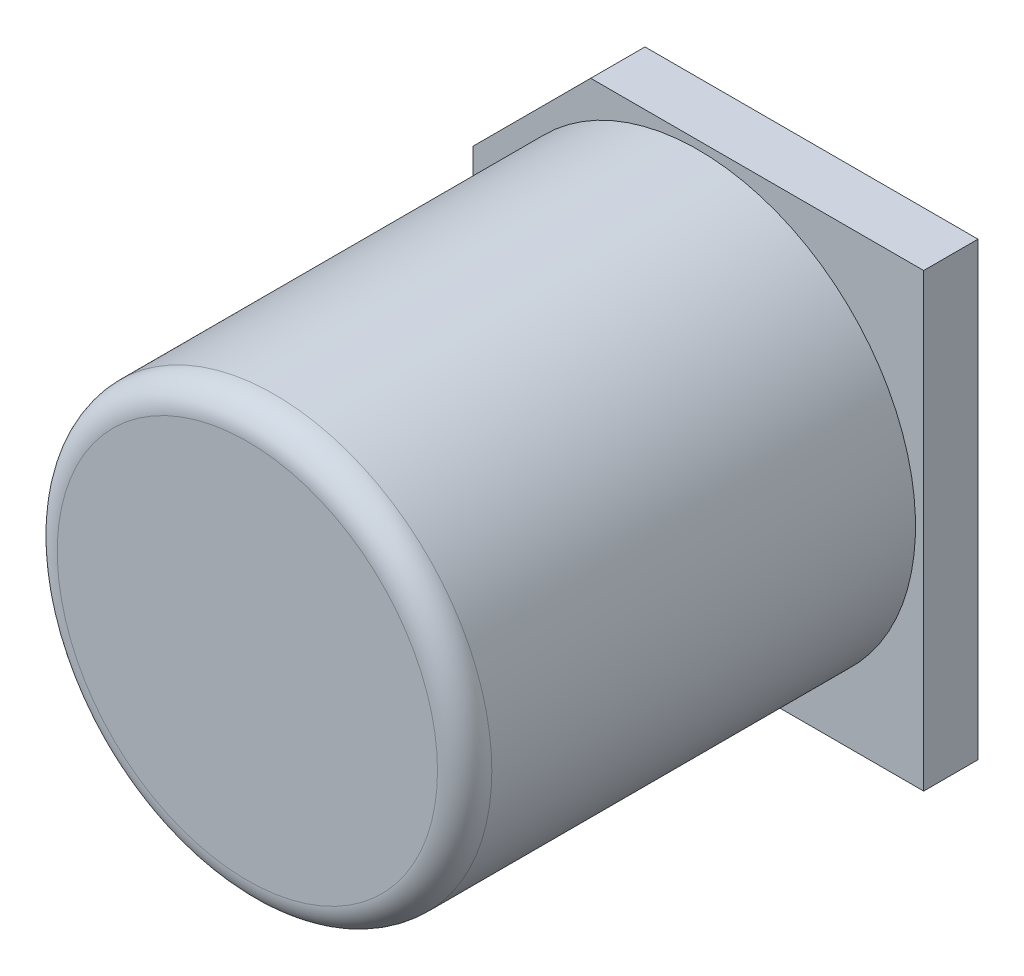
ISO-10303-21;
HEADER;
FILE_DESCRIPTION(('STEP AP214'),'2;1');
FILE_NAME('part.step','',(''),(''),'','','');
FILE_SCHEMA(('AUTOMOTIVE_DESIGN { 1 0 10303 214 1 1 1 1 }'));
ENDSEC;
DATA;
#1=APPLICATION_CONTEXT('core data for automotive mechanical design processes');
#2=APPLICATION_PROTOCOL_DEFINITION('international standard','automotive_design',2000,#1);
#3=PRODUCT_CONTEXT('',#1,'mechanical');
#4=PRODUCT('Part','Part','',(#3));
#5=PRODUCT_RELATED_PRODUCT_CATEGORY('part','',(#4));
#6=PRODUCT_DEFINITION_FORMATION('','',#4);
#7=PRODUCT_DEFINITION_CONTEXT('part definition',#1,'design');
#8=PRODUCT_DEFINITION('design','',#6,#7);
#9=PRODUCT_DEFINITION_SHAPE('','',#8);
#10=(LENGTH_UNIT() NAMED_UNIT(*) SI_UNIT(.MILLI.,.METRE.));
#11=(NAMED_UNIT(*) PLANE_ANGLE_UNIT() SI_UNIT($,.RADIAN.));
#12=(NAMED_UNIT(*) SI_UNIT($,.STERADIAN.) SOLID_ANGLE_UNIT());
#13=UNCERTAINTY_MEASURE_WITH_UNIT(LENGTH_MEASURE(1.E-05),#10,'distance_accuracy_value','');
#14=(GEOMETRIC_REPRESENTATION_CONTEXT(3) GLOBAL_UNCERTAINTY_ASSIGNED_CONTEXT((#13)) GLOBAL_UNIT_ASSIGNED_CONTEXT((#10,
#11,#12)) REPRESENTATION_CONTEXT('',''));
#15=CARTESIAN_POINT('',(0.,0.,0.));
#16=DIRECTION('',(0.,0.,1.));
#17=DIRECTION('',(1.,0.,0.));
#18=AXIS2_PLACEMENT_3D('',#15,#16,#17);
#19=CARTESIAN_POINT('',(4.15,4.15,1.));
#20=DIRECTION('',(-1.,0.,0.));
#21=DIRECTION('',(0.,0.,1.));
#22=AXIS2_PLACEMENT_3D('',#19,#20,#21);
#23=PLANE('',#22);
#24=DIRECTION('',(0.,1.,0.));
#25=VECTOR('',#24,1.);
#26=CARTESIAN_POINT('',(4.15,4.15,0.));
#27=LINE('',#26,#25);
#28=CARTESIAN_POINT('',(4.15,-4.15,0.));
#29=VERTEX_POINT('',#28);
#30=CARTESIAN_POINT('',(4.15,4.15,0.));
#31=VERTEX_POINT('',#30);
#32=EDGE_CURVE('E143',#29,#31,#27,.T.);
#33=ORIENTED_EDGE('',*,*,#32,.T.);
#34=DIRECTION('',(0.,0.,-1.));
#35=VECTOR('',#34,1.);
#36=CARTESIAN_POINT('',(4.15,4.15,1.));
#37=LINE('',#36,#35);
#38=CARTESIAN_POINT('',(4.15,4.15,1.));
#39=VERTEX_POINT('',#38);
#40=EDGE_CURVE('E169',#39,#31,#37,.T.);
#41=ORIENTED_EDGE('',*,*,#40,.F.);
#42=DIRECTION('',(0.,1.,0.));
#43=VECTOR('',#42,1.);
#44=CARTESIAN_POINT('',(4.15,4.15,1.));
#45=LINE('',#44,#43);
#46=CARTESIAN_POINT('',(4.15,-4.15,1.));
#47=VERTEX_POINT('',#46);
#48=EDGE_CURVE('E158',#47,#39,#45,.T.);
#49=ORIENTED_EDGE('',*,*,#48,.F.);
#50=DIRECTION('',(0.,0.,-1.));
#51=VECTOR('',#50,1.);
#52=CARTESIAN_POINT('',(4.15,-4.15,1.));
#53=LINE('',#52,#51);
#54=EDGE_CURVE('E139',#47,#29,#53,.T.);
#55=ORIENTED_EDGE('',*,*,#54,.T.);
#56=EDGE_LOOP('',(#33,#41,#49,#55));
#57=FACE_BOUND('',#56,.T.);
#58=ADVANCED_FACE('F51',(#57),#23,.F.);
#59=CARTESIAN_POINT('',(4.15,4.15,1.));
#60=DIRECTION('',(0.,-1.,0.));
#61=DIRECTION('',(1.,0.,0.));
#62=AXIS2_PLACEMENT_3D('',#59,#60,#61);
#63=PLANE('',#62);
#64=DIRECTION('',(-1.,0.,0.));
#65=VECTOR('',#64,1.);
#66=CARTESIAN_POINT('',(4.15,4.15,0.));
#67=LINE('',#66,#65);
#68=CARTESIAN_POINT('',(-1.98,4.15,0.));
#69=VERTEX_POINT('',#68);
#70=EDGE_CURVE('E146',#31,#69,#67,.T.);
#71=ORIENTED_EDGE('',*,*,#70,.T.);
#72=DIRECTION('',(0.,0.,-1.));
#73=VECTOR('',#72,1.);
#74=CARTESIAN_POINT('',(-1.98,4.15,1.));
#75=LINE('',#74,#73);
#76=CARTESIAN_POINT('',(-1.98,4.15,1.));
#77=VERTEX_POINT('',#76);
#78=EDGE_CURVE('E165',#77,#69,#75,.T.);
#79=ORIENTED_EDGE('',*,*,#78,.F.);
#80=DIRECTION('',(-1.,0.,0.));
#81=VECTOR('',#80,1.);
#82=CARTESIAN_POINT('',(4.15,4.15,1.));
#83=LINE('',#82,#81);
#84=EDGE_CURVE('E107',#39,#77,#83,.T.);
#85=ORIENTED_EDGE('',*,*,#84,.F.);
#86=ORIENTED_EDGE('',*,*,#40,.T.);
#87=EDGE_LOOP('',(#71,#79,#85,#86));
#88=FACE_BOUND('',#87,.T.);
#89=ADVANCED_FACE('F188',(#88),#63,.F.);
#90=CARTESIAN_POINT('',(-1.98,4.15,1.));
#91=DIRECTION('',(0.707106781186548,-0.707106781186547,0.));
#92=DIRECTION('',(0.707106781186547,0.707106781186548,0.));
#93=AXIS2_PLACEMENT_3D('',#90,#91,#92);
#94=PLANE('',#93);
#95=DIRECTION('',(-0.707106781186547,-0.707106781186548,0.));
#96=VECTOR('',#95,1.);
#97=CARTESIAN_POINT('',(-1.98,4.15,0.));
#98=LINE('',#97,#96);
#99=CARTESIAN_POINT('',(-4.15,1.98,0.));
#100=VERTEX_POINT('',#99);
#101=EDGE_CURVE('E149',#69,#100,#98,.T.);
#102=ORIENTED_EDGE('',*,*,#101,.T.);
#103=DIRECTION('',(0.,0.,-1.));
#104=VECTOR('',#103,1.);
#105=CARTESIAN_POINT('',(-4.15,1.98,1.));
#106=LINE('',#105,#104);
#107=CARTESIAN_POINT('',(-4.15,1.98,1.));
#108=VERTEX_POINT('',#107);
#109=EDGE_CURVE('E131',#108,#100,#106,.T.);
#110=ORIENTED_EDGE('',*,*,#109,.F.);
#111=DIRECTION('',(-0.707106781186547,-0.707106781186548,0.));
#112=VECTOR('',#111,1.);
#113=CARTESIAN_POINT('',(-1.98,4.15,1.));
#114=LINE('',#113,#112);
#115=EDGE_CURVE('E120',#77,#108,#114,.T.);
#116=ORIENTED_EDGE('',*,*,#115,.F.);
#117=ORIENTED_EDGE('',*,*,#78,.T.);
#118=EDGE_LOOP('',(#102,#110,#116,#117));
#119=FACE_BOUND('',#118,.T.);
#120=ADVANCED_FACE('F191',(#119),#94,.F.);
#121=CARTESIAN_POINT('',(-4.15,1.98,1.));
#122=DIRECTION('',(1.,0.,0.));
#123=DIRECTION('',(0.,1.,0.));
#124=AXIS2_PLACEMENT_3D('',#121,#122,#123);
#125=PLANE('',#124);
#126=DIRECTION('',(0.,-1.,0.));
#127=VECTOR('',#126,1.);
#128=CARTESIAN_POINT('',(-4.15,1.98,0.));
#129=LINE('',#128,#127);
#130=CARTESIAN_POINT('',(-4.15,-1.98,0.));
#131=VERTEX_POINT('',#130);
#132=EDGE_CURVE('E129',#100,#131,#129,.T.);
#133=ORIENTED_EDGE('',*,*,#132,.T.);
#134=DIRECTION('',(0.,0.,-1.));
#135=VECTOR('',#134,1.);
#136=CARTESIAN_POINT('',(-4.15,-1.98,1.));
#137=LINE('',#136,#135);
#138=CARTESIAN_POINT('',(-4.15,-1.98,1.));
#139=VERTEX_POINT('',#138);
#140=EDGE_CURVE('E126',#139,#131,#137,.T.);
#141=ORIENTED_EDGE('',*,*,#140,.F.);
#142=DIRECTION('',(0.,-1.,0.));
#143=VECTOR('',#142,1.);
#144=CARTESIAN_POINT('',(-4.15,1.98,1.));
#145=LINE('',#144,#143);
#146=EDGE_CURVE('E114',#108,#139,#145,.T.);
#147=ORIENTED_EDGE('',*,*,#146,.F.);
#148=ORIENTED_EDGE('',*,*,#109,.T.);
#149=EDGE_LOOP('',(#133,#141,#147,#148));
#150=FACE_BOUND('',#149,.T.);
#151=ADVANCED_FACE('F127',(#150),#125,.F.);
#152=CARTESIAN_POINT('',(-1.98,-4.15,1.));
#153=DIRECTION('',(0.707106781186547,0.707106781186548,0.));
#154=DIRECTION('',(-0.707106781186548,0.707106781186547,0.));
#155=AXIS2_PLACEMENT_3D('',#152,#153,#154);
#156=PLANE('',#155);
#157=DIRECTION('',(0.707106781186548,-0.707106781186547,0.));
#158=VECTOR('',#157,1.);
#159=CARTESIAN_POINT('',(-1.98,-4.15,0.));
#160=LINE('',#159,#158);
#161=CARTESIAN_POINT('',(-1.98,-4.15,0.));
#162=VERTEX_POINT('',#161);
#163=EDGE_CURVE('E92',#131,#162,#160,.T.);
#164=ORIENTED_EDGE('',*,*,#163,.T.);
#165=DIRECTION('',(0.,0.,-1.));
#166=VECTOR('',#165,1.);
#167=CARTESIAN_POINT('',(-1.98,-4.15,1.));
#168=LINE('',#167,#166);
#169=CARTESIAN_POINT('',(-1.98,-4.15,1.));
#170=VERTEX_POINT('',#169);
#171=EDGE_CURVE('E132',#170,#162,#168,.T.);
#172=ORIENTED_EDGE('',*,*,#171,.F.);
#173=DIRECTION('',(0.707106781186548,-0.707106781186547,0.));
#174=VECTOR('',#173,1.);
#175=CARTESIAN_POINT('',(-1.98,-4.15,1.));
#176=LINE('',#175,#174);
#177=EDGE_CURVE('E118',#139,#170,#176,.T.);
#178=ORIENTED_EDGE('',*,*,#177,.F.);
#179=ORIENTED_EDGE('',*,*,#140,.T.);
#180=EDGE_LOOP('',(#164,#172,#178,#179));
#181=FACE_BOUND('',#180,.T.);
#182=ADVANCED_FACE('F134',(#181),#156,.F.);
#183=CARTESIAN_POINT('',(4.15,-4.15,1.));
#184=DIRECTION('',(0.,1.,0.));
#185=DIRECTION('',(-1.,0.,0.));
#186=AXIS2_PLACEMENT_3D('',#183,#184,#185);
#187=PLANE('',#186);
#188=DIRECTION('',(1.,0.,0.));
#189=VECTOR('',#188,1.);
#190=CARTESIAN_POINT('',(4.15,-4.15,0.));
#191=LINE('',#190,#189);
#192=EDGE_CURVE('E98',#162,#29,#191,.T.);
#193=ORIENTED_EDGE('',*,*,#192,.T.);
#194=ORIENTED_EDGE('',*,*,#54,.F.);
#195=DIRECTION('',(1.,0.,0.));
#196=VECTOR('',#195,1.);
#197=CARTESIAN_POINT('',(4.15,-4.15,1.));
#198=LINE('',#197,#196);
#199=EDGE_CURVE('E69',#170,#47,#198,.T.);
#200=ORIENTED_EDGE('',*,*,#199,.F.);
#201=ORIENTED_EDGE('',*,*,#171,.T.);
#202=EDGE_LOOP('',(#193,#194,#200,#201));
#203=FACE_BOUND('',#202,.T.);
#204=ADVANCED_FACE('F196',(#203),#187,.F.);
#205=CARTESIAN_POINT('',(0.,0.,1.));
#206=DIRECTION('',(0.,0.,-1.));
#207=DIRECTION('',(-1.,0.,0.));
#208=AXIS2_PLACEMENT_3D('',#205,#206,#207);
#209=PLANE('',#208);
#210=CARTESIAN_POINT('',(0.,0.,1.));
#211=DIRECTION('',(0.,0.,1.));
#212=DIRECTION('',(1.,0.,0.));
#213=AXIS2_PLACEMENT_3D('',#210,#211,#212);
#214=CIRCLE('',#213,4.);
#215=CARTESIAN_POINT('',(-4.,0.,0.999999999999999));
#216=VERTEX_POINT('',#215);
#217=EDGE_CURVE('E171',#216,#216,#214,.T.);
#218=ORIENTED_EDGE('',*,*,#217,.F.);
#219=EDGE_LOOP('',(#218));
#220=FACE_BOUND('',#219,.T.);
#221=ORIENTED_EDGE('',*,*,#48,.T.);
#222=ORIENTED_EDGE('',*,*,#84,.T.);
#223=ORIENTED_EDGE('',*,*,#115,.T.);
#224=ORIENTED_EDGE('',*,*,#146,.T.);
#225=ORIENTED_EDGE('',*,*,#177,.T.);
#226=ORIENTED_EDGE('',*,*,#199,.T.);
#227=EDGE_LOOP('',(#221,#222,#223,#224,#225,#226));
#228=FACE_BOUND('',#227,.T.);
#229=ADVANCED_FACE('F116',(#220,#228),#209,.F.);
#230=CARTESIAN_POINT('',(0.,0.,0.));
#231=DIRECTION('',(0.,0.,-1.));
#232=DIRECTION('',(-1.,0.,0.));
#233=AXIS2_PLACEMENT_3D('',#230,#231,#232);
#234=PLANE('',#233);
#235=ORIENTED_EDGE('',*,*,#32,.F.);
#236=ORIENTED_EDGE('',*,*,#192,.F.);
#237=ORIENTED_EDGE('',*,*,#163,.F.);
#238=ORIENTED_EDGE('',*,*,#132,.F.);
#239=ORIENTED_EDGE('',*,*,#101,.F.);
#240=ORIENTED_EDGE('',*,*,#70,.F.);
#241=EDGE_LOOP('',(#235,#236,#237,#238,#239,#240));
#242=FACE_BOUND('',#241,.T.);
#243=ADVANCED_FACE('F194',(#242),#234,.T.);
#244=CARTESIAN_POINT('',(0.,0.,9.3));
#245=DIRECTION('',(0.,0.,-1.));
#246=DIRECTION('',(-1.,0.,0.));
#247=AXIS2_PLACEMENT_3D('',#244,#245,#246);
#248=CYLINDRICAL_SURFACE('',#247,4.);
#249=CARTESIAN_POINT('',(0.,0.,8.8));
#250=DIRECTION('',(0.,0.,1.));
#251=DIRECTION('',(1.,0.,0.));
#252=AXIS2_PLACEMENT_3D('',#249,#250,#251);
#253=CIRCLE('',#252,4.);
#254=CARTESIAN_POINT('',(-4.,0.,8.8));
#255=VERTEX_POINT('',#254);
#256=EDGE_CURVE('E11',#255,#255,#253,.F.);
#257=CARTESIAN_POINT('',(-4.,0.,8.8));
#258=CARTESIAN_POINT('',(-4.,0.,8.71875));
#259=CARTESIAN_POINT('',(-4.,0.,8.6375));
#260=CARTESIAN_POINT('',(-4.,0.,8.475));
#261=CARTESIAN_POINT('',(-4.,0.,8.39375));
#262=CARTESIAN_POINT('',(-4.,0.,8.23125));
#263=CARTESIAN_POINT('',(-4.,0.,8.15));
#264=CARTESIAN_POINT('',(-4.,0.,7.9875));
#265=CARTESIAN_POINT('',(-4.,0.,7.90625));
#266=CARTESIAN_POINT('',(-4.,0.,7.74375));
#267=CARTESIAN_POINT('',(-4.,0.,7.6625));
#268=CARTESIAN_POINT('',(-4.,0.,7.5));
#269=CARTESIAN_POINT('',(-4.,0.,7.41875));
#270=CARTESIAN_POINT('',(-4.,0.,7.25625));
#271=CARTESIAN_POINT('',(-4.,0.,7.175));
#272=CARTESIAN_POINT('',(-4.,0.,7.0125));
#273=CARTESIAN_POINT('',(-4.,0.,6.93125));
#274=CARTESIAN_POINT('',(-4.,0.,6.76875));
#275=CARTESIAN_POINT('',(-4.,0.,6.6875));
#276=CARTESIAN_POINT('',(-4.,0.,6.525));
#277=CARTESIAN_POINT('',(-4.,0.,6.44375));
#278=CARTESIAN_POINT('',(-4.,0.,6.28125));
#279=CARTESIAN_POINT('',(-4.,0.,6.2));
#280=CARTESIAN_POINT('',(-4.,0.,6.0375));
#281=CARTESIAN_POINT('',(-4.,0.,5.95625));
#282=CARTESIAN_POINT('',(-4.,0.,5.79375));
#283=CARTESIAN_POINT('',(-4.,0.,5.7125));
#284=CARTESIAN_POINT('',(-4.,0.,5.55));
#285=CARTESIAN_POINT('',(-4.,0.,5.46875));
#286=CARTESIAN_POINT('',(-4.,0.,5.30625));
#287=CARTESIAN_POINT('',(-4.,0.,5.225));
#288=CARTESIAN_POINT('',(-4.,0.,5.0625));
#289=CARTESIAN_POINT('',(-4.,0.,4.98125));
#290=CARTESIAN_POINT('',(-4.,0.,4.81875));
#291=CARTESIAN_POINT('',(-4.,0.,4.7375));
#292=CARTESIAN_POINT('',(-4.,0.,4.575));
#293=CARTESIAN_POINT('',(-4.,0.,4.49375));
#294=CARTESIAN_POINT('',(-4.,0.,4.33125));
#295=CARTESIAN_POINT('',(-4.,0.,4.25));
#296=CARTESIAN_POINT('',(-4.,0.,4.0875));
#297=CARTESIAN_POINT('',(-4.,0.,4.00625));
#298=CARTESIAN_POINT('',(-4.,0.,3.84375));
#299=CARTESIAN_POINT('',(-4.,0.,3.7625));
#300=CARTESIAN_POINT('',(-4.,0.,3.6));
#301=CARTESIAN_POINT('',(-4.,0.,3.51875));
#302=CARTESIAN_POINT('',(-4.,0.,3.35625));
#303=CARTESIAN_POINT('',(-4.,0.,3.275));
#304=CARTESIAN_POINT('',(-4.,0.,3.1125));
#305=CARTESIAN_POINT('',(-4.,0.,3.03125));
#306=CARTESIAN_POINT('',(-4.,0.,2.86875));
#307=CARTESIAN_POINT('',(-4.,0.,2.7875));
#308=CARTESIAN_POINT('',(-4.,0.,2.625));
#309=CARTESIAN_POINT('',(-4.,0.,2.54375));
#310=CARTESIAN_POINT('',(-4.,0.,2.38125));
#311=CARTESIAN_POINT('',(-4.,0.,2.3));
#312=CARTESIAN_POINT('',(-4.,0.,2.1375));
#313=CARTESIAN_POINT('',(-4.,0.,2.05625));
#314=CARTESIAN_POINT('',(-4.,0.,1.89375));
#315=CARTESIAN_POINT('',(-4.,0.,1.8125));
#316=CARTESIAN_POINT('',(-4.,0.,1.65));
#317=CARTESIAN_POINT('',(-4.,0.,1.56875));
#318=CARTESIAN_POINT('',(-4.,0.,1.40625));
#319=CARTESIAN_POINT('',(-4.,0.,1.325));
#320=CARTESIAN_POINT('',(-4.,0.,1.1625));
#321=CARTESIAN_POINT('',(-4.,0.,1.08125));
#322=CARTESIAN_POINT('',(-4.,0.,0.999999999999999));
#323=B_SPLINE_CURVE_WITH_KNOTS('',3,(#257,#258,#259,#260,#261,#262,#263,#264,#265,#266,#267,
#268,#269,#270,#271,#272,#273,#274,#275,#276,#277,#278,#279,#280,#281,#282,#283,#284,#285,#286,
#287,#288,#289,#290,#291,#292,#293,#294,#295,#296,#297,#298,#299,#300,#301,#302,#303,#304,#305,
#306,#307,#308,#309,#310,#311,#312,#313,#314,#315,#316,#317,#318,#319,#320,#321,#322),
.UNSPECIFIED.,.F.,.F.,(4,2,2,2,2,2,2,2,2,2,2,2,2,2,2,2,2,2,2,2,2,2,2,2,2,2,2,2,2,2,2,2,4),(0.,
0.243749999999999,0.4875,0.731249999999999,0.974999999999998,1.21875,1.4625,1.70625,1.95,
2.19375,2.4375,2.68125,2.925,3.16875,3.4125,3.65625,3.9,4.14375,4.3875,4.63125,4.875,5.11875,
5.3625,5.60625,5.85,6.09375,6.3375,6.58125,6.825,7.06875,7.3125,7.55625,7.8),.UNSPECIFIED.);
#324=EDGE_CURVE('BSEAM240',#255,#216,#323,.T.);
#325=ORIENTED_EDGE('',*,*,#256,.T.);
#326=ORIENTED_EDGE('',*,*,#217,.T.);
#327=ORIENTED_EDGE('',*,*,#324,.T.);
#328=ORIENTED_EDGE('',*,*,#324,.F.);
#329=EDGE_LOOP('',(#325,#327,#326,#328));
#330=FACE_BOUND('',#329,.T.);
#331=ADVANCED_FACE('F240',(#330),#248,.T.);
#332=CARTESIAN_POINT('',(0.,0.,9.3));
#333=DIRECTION('',(0.,0.,1.));
#334=DIRECTION('',(1.,0.,0.));
#335=AXIS2_PLACEMENT_3D('',#332,#333,#334);
#336=PLANE('',#335);
#337=CARTESIAN_POINT('',(0.,0.,9.3));
#338=DIRECTION('',(0.,0.,1.));
#339=DIRECTION('',(1.,0.,0.));
#340=AXIS2_PLACEMENT_3D('',#337,#338,#339);
#341=CIRCLE('',#340,3.5);
#342=CARTESIAN_POINT('',(3.5,0.,9.3));
#343=VERTEX_POINT('',#342);
#344=EDGE_CURVE('E61',#343,#343,#341,.T.);
#345=ORIENTED_EDGE('',*,*,#344,.T.);
#346=EDGE_LOOP('',(#345));
#347=FACE_BOUND('',#346,.T.);
#348=ADVANCED_FACE('F247',(#347),#336,.T.);
#349=CARTESIAN_POINT('',(0.,0.,8.8));
#350=DIRECTION('',(0.,0.,1.));
#351=DIRECTION('',(1.,0.,0.));
#352=AXIS2_PLACEMENT_3D('',#349,#350,#351);
#353=TOROIDAL_SURFACE('',#352,3.5,0.5);
#354=ORIENTED_EDGE('',*,*,#256,.F.);
#355=EDGE_LOOP('',(#354));
#356=FACE_BOUND('',#355,.T.);
#357=ORIENTED_EDGE('',*,*,#344,.F.);
#358=EDGE_LOOP('',(#357));
#359=FACE_BOUND('',#358,.T.);
#360=ADVANCED_FACE('F53',(#356,#359),#353,.T.);
#361=CLOSED_SHELL('',(#58,#89,#120,#151,#182,#204,#229,#243,#331,#348,#360));
#362=MANIFOLD_SOLID_BREP('B2',#361);
#363=ADVANCED_BREP_SHAPE_REPRESENTATION('',(#18,#362),#14);
#364=SHAPE_DEFINITION_REPRESENTATION(#9,#363);
ENDSEC;
END-ISO-10303-21;
